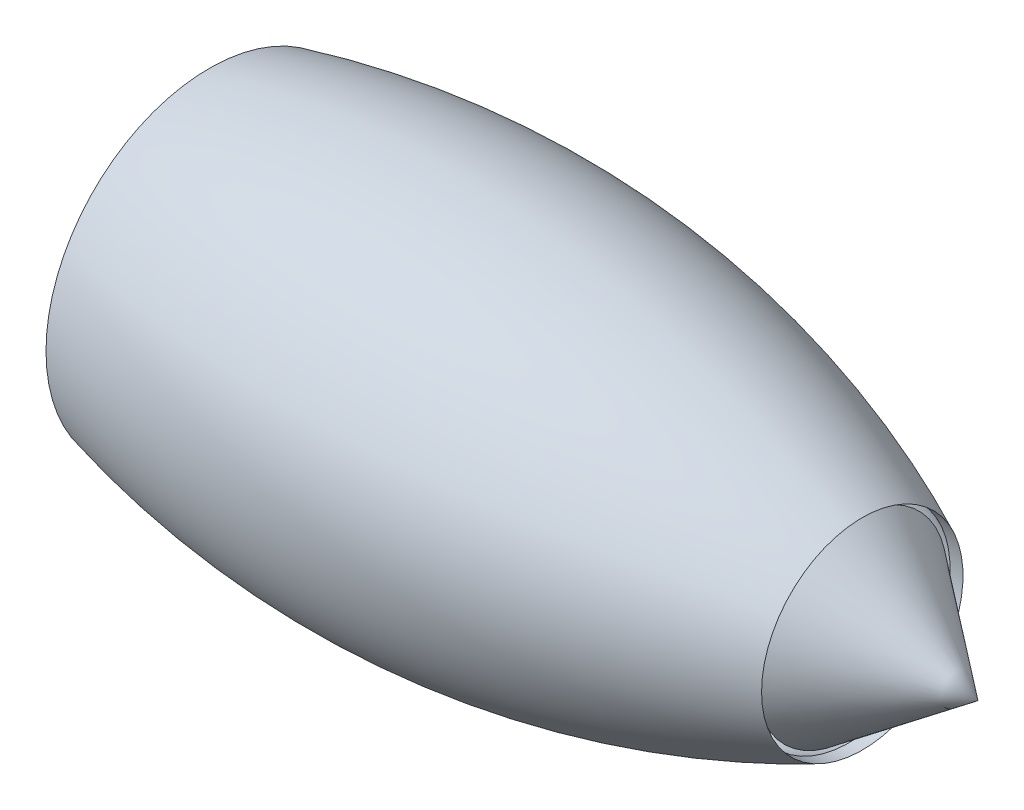
ISO-10303-21;
HEADER;
FILE_DESCRIPTION(('STEP AP214'),'2;1');
FILE_NAME('part.step','',(''),(''),'','','');
FILE_SCHEMA(('AUTOMOTIVE_DESIGN { 1 0 10303 214 1 1 1 1 }'));
ENDSEC;
DATA;
#1=APPLICATION_CONTEXT('core data for automotive mechanical design processes');
#2=APPLICATION_PROTOCOL_DEFINITION('international standard','automotive_design',2000,#1);
#3=PRODUCT_CONTEXT('',#1,'mechanical');
#4=PRODUCT('Part','Part','',(#3));
#5=PRODUCT_RELATED_PRODUCT_CATEGORY('part','',(#4));
#6=PRODUCT_DEFINITION_FORMATION('','',#4);
#7=PRODUCT_DEFINITION_CONTEXT('part definition',#1,'design');
#8=PRODUCT_DEFINITION('design','',#6,#7);
#9=PRODUCT_DEFINITION_SHAPE('','',#8);
#10=(LENGTH_UNIT() NAMED_UNIT(*) SI_UNIT(.MILLI.,.METRE.));
#11=(NAMED_UNIT(*) PLANE_ANGLE_UNIT() SI_UNIT($,.RADIAN.));
#12=(NAMED_UNIT(*) SI_UNIT($,.STERADIAN.) SOLID_ANGLE_UNIT());
#13=UNCERTAINTY_MEASURE_WITH_UNIT(LENGTH_MEASURE(1.E-05),#10,'distance_accuracy_value','');
#14=(GEOMETRIC_REPRESENTATION_CONTEXT(3) GLOBAL_UNCERTAINTY_ASSIGNED_CONTEXT((#13)) GLOBAL_UNIT_ASSIGNED_CONTEXT((#10,
#11,#12)) REPRESENTATION_CONTEXT('',''));
#15=CARTESIAN_POINT('',(0.,0.,0.));
#16=DIRECTION('',(0.,0.,1.));
#17=DIRECTION('',(1.,0.,0.));
#18=AXIS2_PLACEMENT_3D('',#15,#16,#17);
#19=CARTESIAN_POINT('',(-43.8020740900036,0.,0.));
#20=DIRECTION('',(-1.,0.,0.));
#21=DIRECTION('',(0.,0.,1.));
#22=AXIS2_PLACEMENT_3D('',#19,#20,#21);
#23=DEGENERATE_TOROIDAL_SURFACE('',#22,951.000640691302,1178.2463743247,.F.);
#24=CARTESIAN_POINT('',(442.736242548288,0.,0.));
#25=DIRECTION('',(-1.,0.,0.));
#26=DIRECTION('',(0.,0.,1.));
#27=AXIS2_PLACEMENT_3D('',#24,#25,#26);
#28=CIRCLE('',#27,122.1);
#29=CARTESIAN_POINT('',(442.736242548288,0.,122.1));
#30=VERTEX_POINT('',#29);
#31=EDGE_CURVE('E65',#30,#30,#28,.F.);
#32=ORIENTED_EDGE('',*,*,#31,.T.);
#33=EDGE_LOOP('',(#32));
#34=FACE_BOUND('',#33,.T.);
#35=CARTESIAN_POINT('',(-326.439793693394,0.,0.));
#36=DIRECTION('',(-1.,0.,0.));
#37=DIRECTION('',(0.,0.,1.));
#38=AXIS2_PLACEMENT_3D('',#35,#36,#37);
#39=CIRCLE('',#38,192.843945809286);
#40=CARTESIAN_POINT('',(-326.439793693394,0.,192.843945809286));
#41=VERTEX_POINT('',#40);
#42=EDGE_CURVE('E52',#41,#41,#39,.T.);
#43=ORIENTED_EDGE('',*,*,#42,.T.);
#44=EDGE_LOOP('',(#43));
#45=FACE_BOUND('',#44,.T.);
#46=ADVANCED_FACE('F44',(#34,#45),#23,.T.);
#47=CARTESIAN_POINT('',(-326.439793693393,0.,0.));
#48=DIRECTION('',(-1.,0.,0.));
#49=DIRECTION('',(0.,0.,1.));
#50=AXIS2_PLACEMENT_3D('',#47,#48,#49);
#51=PLANE('',#50);
#52=CARTESIAN_POINT('',(-326.439793693393,0.,0.));
#53=DIRECTION('',(-1.,0.,0.));
#54=DIRECTION('',(0.,0.,1.));
#55=AXIS2_PLACEMENT_3D('',#52,#53,#54);
#56=CIRCLE('',#55,188.1);
#57=CARTESIAN_POINT('',(-326.439793693393,0.,188.1));
#58=VERTEX_POINT('',#57);
#59=EDGE_CURVE('E57',#58,#58,#56,.T.);
#60=ORIENTED_EDGE('',*,*,#59,.T.);
#61=EDGE_LOOP('',(#60));
#62=FACE_BOUND('',#61,.T.);
#63=ORIENTED_EDGE('',*,*,#42,.F.);
#64=EDGE_LOOP('',(#63));
#65=FACE_BOUND('',#64,.T.);
#66=ADVANCED_FACE('F87',(#62,#65),#51,.F.);
#67=CARTESIAN_POINT('',(-247.239793693393,0.,0.));
#68=DIRECTION('',(-1.,0.,0.));
#69=DIRECTION('',(0.,0.,1.));
#70=AXIS2_PLACEMENT_3D('',#67,#68,#69);
#71=CYLINDRICAL_SURFACE('',#70,188.1);
#72=CARTESIAN_POINT('',(-333.039793693393,0.,0.));
#73=DIRECTION('',(-1.,0.,0.));
#74=DIRECTION('',(0.,0.,1.));
#75=AXIS2_PLACEMENT_3D('',#72,#73,#74);
#76=CIRCLE('',#75,188.1);
#77=CARTESIAN_POINT('',(-333.039793693393,0.,188.1));
#78=VERTEX_POINT('',#77);
#79=EDGE_CURVE('E61',#78,#78,#76,.T.);
#80=ORIENTED_EDGE('',*,*,#79,.T.);
#81=EDGE_LOOP('',(#80));
#82=FACE_BOUND('',#81,.T.);
#83=ORIENTED_EDGE('',*,*,#59,.F.);
#84=EDGE_LOOP('',(#83));
#85=FACE_BOUND('',#84,.T.);
#86=ADVANCED_FACE('F92',(#82,#85),#71,.F.);
#87=CARTESIAN_POINT('',(-333.039793693393,0.,0.));
#88=DIRECTION('',(1.,0.,0.));
#89=DIRECTION('',(0.,0.,-1.));
#90=AXIS2_PLACEMENT_3D('',#87,#88,#89);
#91=PLANE('',#90);
#92=ORIENTED_EDGE('',*,*,#79,.F.);
#93=EDGE_LOOP('',(#92));
#94=FACE_BOUND('',#93,.T.);
#95=CARTESIAN_POINT('',(-333.039793693393,0.,0.));
#96=DIRECTION('',(-1.,0.,0.));
#97=DIRECTION('',(0.,0.,1.));
#98=AXIS2_PLACEMENT_3D('',#95,#96,#97);
#99=CIRCLE('',#98,198.);
#100=CARTESIAN_POINT('',(-333.039793693393,0.,198.));
#101=VERTEX_POINT('',#100);
#102=EDGE_CURVE('E11',#101,#101,#99,.T.);
#103=ORIENTED_EDGE('',*,*,#102,.T.);
#104=EDGE_LOOP('',(#103));
#105=FACE_BOUND('',#104,.T.);
#106=ADVANCED_FACE('F46',(#94,#105),#91,.F.);
#107=CARTESIAN_POINT('',(-43.8020740900036,0.,0.));
#108=DIRECTION('',(-1.,0.,0.));
#109=DIRECTION('',(0.,0.,1.));
#110=AXIS2_PLACEMENT_3D('',#107,#108,#109);
#111=DEGENERATE_TOROIDAL_SURFACE('',#110,951.000640691302,1184.8463743247,.F.);
#112=CARTESIAN_POINT('',(458.508532704546,0.,0.));
#113=DIRECTION('',(-1.,0.,0.));
#114=DIRECTION('',(0.,0.,1.));
#115=AXIS2_PLACEMENT_3D('',#112,#113,#114);
#116=CIRCLE('',#115,122.1);
#117=CARTESIAN_POINT('',(458.508532704546,0.,122.1));
#118=VERTEX_POINT('',#117);
#119=EDGE_CURVE('E48',#118,#118,#116,.T.);
#120=ORIENTED_EDGE('',*,*,#119,.T.);
#121=EDGE_LOOP('',(#120));
#122=FACE_BOUND('',#121,.T.);
#123=ORIENTED_EDGE('',*,*,#102,.F.);
#124=EDGE_LOOP('',(#123));
#125=FACE_BOUND('',#124,.T.);
#126=ADVANCED_FACE('F75',(#122,#125),#111,.F.);
#127=CARTESIAN_POINT('',(340.160206306607,0.,0.));
#128=DIRECTION('',(1.,0.,0.));
#129=DIRECTION('',(0.,0.,-1.));
#130=AXIS2_PLACEMENT_3D('',#127,#128,#129);
#131=CYLINDRICAL_SURFACE('',#130,122.1);
#132=ORIENTED_EDGE('',*,*,#119,.F.);
#133=EDGE_LOOP('',(#132));
#134=FACE_BOUND('',#133,.T.);
#135=ORIENTED_EDGE('',*,*,#31,.F.);
#136=EDGE_LOOP('',(#135));
#137=FACE_BOUND('',#136,.T.);
#138=ADVANCED_FACE('F78',(#134,#137),#131,.F.);
#139=CLOSED_SHELL('',(#46,#66,#86,#106,#126,#138));
#140=MANIFOLD_SOLID_BREP('B2',#139);
#141=CARTESIAN_POINT('',(445.5,0.,0.));
#142=DIRECTION('',(-1.,0.,0.));
#143=DIRECTION('',(0.,0.,-1.));
#144=AXIS2_PLACEMENT_3D('',#141,#142,#143);
#145=CONICAL_SURFACE('',#144,115.5,0.645771823237903);
#146=CARTESIAN_POINT('',(598.773676897157,0.,0.));
#147=VERTEX_POINT('',#146);
#148=VERTEX_LOOP('',#147);
#149=FACE_BOUND('',#148,.T.);
#150=CARTESIAN_POINT('',(445.5,0.,0.));
#151=DIRECTION('',(1.,0.,0.));
#152=DIRECTION('',(0.,0.,-1.));
#153=AXIS2_PLACEMENT_3D('',#150,#151,#152);
#154=CIRCLE('',#153,115.5);
#155=CARTESIAN_POINT('',(445.5,0.,-115.5));
#156=VERTEX_POINT('',#155);
#157=EDGE_CURVE('E42',#156,#156,#154,.T.);
#158=ORIENTED_EDGE('',*,*,#157,.T.);
#159=EDGE_LOOP('',(#158));
#160=FACE_BOUND('',#159,.T.);
#161=ADVANCED_FACE('F143',(#149,#160),#145,.T.);
#162=CARTESIAN_POINT('',(445.5,0.,0.));
#163=DIRECTION('',(1.,0.,0.));
#164=DIRECTION('',(0.,0.,-1.));
#165=AXIS2_PLACEMENT_3D('',#162,#163,#164);
#166=PLANE('',#165);
#167=ORIENTED_EDGE('',*,*,#157,.F.);
#168=EDGE_LOOP('',(#167));
#169=FACE_BOUND('',#168,.T.);
#170=ADVANCED_FACE('F152',(#169),#166,.F.);
#171=CLOSED_SHELL('',(#161,#170));
#172=MANIFOLD_SOLID_BREP('B6',#171);
#173=ADVANCED_BREP_SHAPE_REPRESENTATION('',(#18,#140,#172),#14);
#174=SHAPE_DEFINITION_REPRESENTATION(#9,#173);
ENDSEC;
END-ISO-10303-21;
